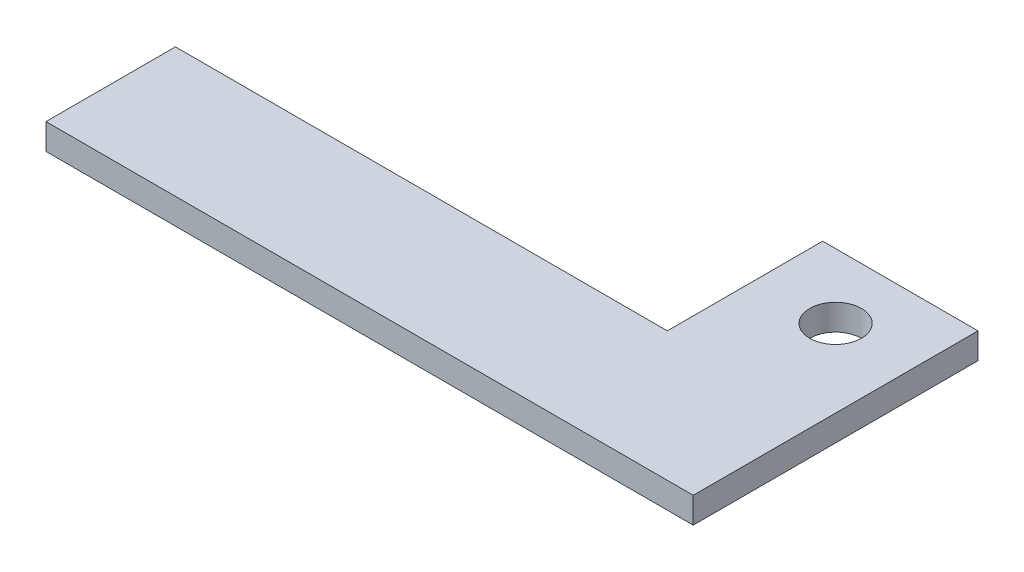
ISO-10303-21;
HEADER;
FILE_DESCRIPTION(('STEP AP214'),'2;1');
FILE_NAME('part.step','',(''),(''),'','','');
FILE_SCHEMA(('AUTOMOTIVE_DESIGN { 1 0 10303 214 1 1 1 1 }'));
ENDSEC;
DATA;
#1=APPLICATION_CONTEXT('core data for automotive mechanical design processes');
#2=APPLICATION_PROTOCOL_DEFINITION('international standard','automotive_design',2000,#1);
#3=PRODUCT_CONTEXT('',#1,'mechanical');
#4=PRODUCT('Part','Part','',(#3));
#5=PRODUCT_RELATED_PRODUCT_CATEGORY('part','',(#4));
#6=PRODUCT_DEFINITION_FORMATION('','',#4);
#7=PRODUCT_DEFINITION_CONTEXT('part definition',#1,'design');
#8=PRODUCT_DEFINITION('design','',#6,#7);
#9=PRODUCT_DEFINITION_SHAPE('','',#8);
#10=(LENGTH_UNIT() NAMED_UNIT(*) SI_UNIT(.MILLI.,.METRE.));
#11=(NAMED_UNIT(*) PLANE_ANGLE_UNIT() SI_UNIT($,.RADIAN.));
#12=(NAMED_UNIT(*) SI_UNIT($,.STERADIAN.) SOLID_ANGLE_UNIT());
#13=UNCERTAINTY_MEASURE_WITH_UNIT(LENGTH_MEASURE(1.E-05),#10,'distance_accuracy_value','');
#14=(GEOMETRIC_REPRESENTATION_CONTEXT(3) GLOBAL_UNCERTAINTY_ASSIGNED_CONTEXT((#13)) GLOBAL_UNIT_ASSIGNED_CONTEXT((#10,
#11,#12)) REPRESENTATION_CONTEXT('',''));
#15=CARTESIAN_POINT('',(0.,0.,0.));
#16=DIRECTION('',(0.,0.,1.));
#17=DIRECTION('',(1.,0.,0.));
#18=AXIS2_PLACEMENT_3D('',#15,#16,#17);
#19=CARTESIAN_POINT('',(0.,2.,0.));
#20=DIRECTION('',(0.,-1.,0.));
#21=DIRECTION('',(0.,0.,-1.));
#22=AXIS2_PLACEMENT_3D('',#19,#20,#21);
#23=PLANE('',#22);
#24=DIRECTION('',(0.,0.,-1.));
#25=VECTOR('',#24,1.);
#26=CARTESIAN_POINT('',(0.,2.,-22.));
#27=LINE('',#26,#25);
#28=CARTESIAN_POINT('',(0.,2.,0.));
#29=VERTEX_POINT('',#28);
#30=CARTESIAN_POINT('',(0.,2.,-22.));
#31=VERTEX_POINT('',#30);
#32=EDGE_CURVE('E128',#29,#31,#27,.T.);
#33=ORIENTED_EDGE('',*,*,#32,.T.);
#34=DIRECTION('',(-1.,0.,0.));
#35=VECTOR('',#34,1.);
#36=CARTESIAN_POINT('',(-12.,2.,-22.));
#37=LINE('',#36,#35);
#38=CARTESIAN_POINT('',(-12.,2.,-22.));
#39=VERTEX_POINT('',#38);
#40=EDGE_CURVE('E86',#31,#39,#37,.T.);
#41=ORIENTED_EDGE('',*,*,#40,.T.);
#42=DIRECTION('',(0.,0.,1.));
#43=VECTOR('',#42,1.);
#44=CARTESIAN_POINT('',(-12.,2.,-10.));
#45=LINE('',#44,#43);
#46=CARTESIAN_POINT('',(-12.,2.,-10.));
#47=VERTEX_POINT('',#46);
#48=EDGE_CURVE('E99',#39,#47,#45,.T.);
#49=ORIENTED_EDGE('',*,*,#48,.T.);
#50=DIRECTION('',(-1.,0.,0.));
#51=VECTOR('',#50,1.);
#52=CARTESIAN_POINT('',(-50.,2.,-9.99999999999999));
#53=LINE('',#52,#51);
#54=CARTESIAN_POINT('',(-50.,2.,-9.99999999999999));
#55=VERTEX_POINT('',#54);
#56=EDGE_CURVE('E93',#47,#55,#53,.T.);
#57=ORIENTED_EDGE('',*,*,#56,.T.);
#58=DIRECTION('',(0.,0.,1.));
#59=VECTOR('',#58,1.);
#60=CARTESIAN_POINT('',(-50.,2.,0.));
#61=LINE('',#60,#59);
#62=CARTESIAN_POINT('',(-50.,2.,0.));
#63=VERTEX_POINT('',#62);
#64=EDGE_CURVE('E97',#55,#63,#61,.T.);
#65=ORIENTED_EDGE('',*,*,#64,.T.);
#66=DIRECTION('',(1.,0.,0.));
#67=VECTOR('',#66,1.);
#68=CARTESIAN_POINT('',(0.,2.,0.));
#69=LINE('',#68,#67);
#70=EDGE_CURVE('E49',#63,#29,#69,.T.);
#71=ORIENTED_EDGE('',*,*,#70,.T.);
#72=EDGE_LOOP('',(#33,#41,#49,#57,#65,#71));
#73=FACE_BOUND('',#72,.T.);
#74=CARTESIAN_POINT('',(-6.,2.,-17.));
#75=DIRECTION('',(0.,1.,0.));
#76=DIRECTION('',(0.,0.,1.));
#77=AXIS2_PLACEMENT_3D('',#74,#75,#76);
#78=CIRCLE('',#77,2.);
#79=CARTESIAN_POINT('',(-6.,2.,-15.));
#80=VERTEX_POINT('',#79);
#81=EDGE_CURVE('E121',#80,#80,#78,.T.);
#82=ORIENTED_EDGE('',*,*,#81,.F.);
#83=EDGE_LOOP('',(#82));
#84=FACE_BOUND('',#83,.T.);
#85=ADVANCED_FACE('F32',(#73,#84),#23,.F.);
#86=CARTESIAN_POINT('',(0.,0.,0.));
#87=DIRECTION('',(0.,-1.,0.));
#88=DIRECTION('',(0.,0.,-1.));
#89=AXIS2_PLACEMENT_3D('',#86,#87,#88);
#90=PLANE('',#89);
#91=DIRECTION('',(0.,0.,-1.));
#92=VECTOR('',#91,1.);
#93=CARTESIAN_POINT('',(0.,0.,-22.));
#94=LINE('',#93,#92);
#95=CARTESIAN_POINT('',(0.,0.,0.));
#96=VERTEX_POINT('',#95);
#97=CARTESIAN_POINT('',(0.,0.,-22.));
#98=VERTEX_POINT('',#97);
#99=EDGE_CURVE('E117',#96,#98,#94,.T.);
#100=ORIENTED_EDGE('',*,*,#99,.F.);
#101=DIRECTION('',(1.,0.,0.));
#102=VECTOR('',#101,1.);
#103=CARTESIAN_POINT('',(0.,0.,0.));
#104=LINE('',#103,#102);
#105=CARTESIAN_POINT('',(-50.,0.,0.));
#106=VERTEX_POINT('',#105);
#107=EDGE_CURVE('E78',#106,#96,#104,.T.);
#108=ORIENTED_EDGE('',*,*,#107,.F.);
#109=DIRECTION('',(0.,0.,1.));
#110=VECTOR('',#109,1.);
#111=CARTESIAN_POINT('',(-50.,0.,0.));
#112=LINE('',#111,#110);
#113=CARTESIAN_POINT('',(-50.,0.,-9.99999999999999));
#114=VERTEX_POINT('',#113);
#115=EDGE_CURVE('E72',#114,#106,#112,.T.);
#116=ORIENTED_EDGE('',*,*,#115,.F.);
#117=DIRECTION('',(-1.,0.,0.));
#118=VECTOR('',#117,1.);
#119=CARTESIAN_POINT('',(-50.,0.,-9.99999999999999));
#120=LINE('',#119,#118);
#121=CARTESIAN_POINT('',(-12.,0.,-10.));
#122=VERTEX_POINT('',#121);
#123=EDGE_CURVE('E107',#122,#114,#120,.T.);
#124=ORIENTED_EDGE('',*,*,#123,.F.);
#125=DIRECTION('',(0.,0.,1.));
#126=VECTOR('',#125,1.);
#127=CARTESIAN_POINT('',(-12.,0.,-10.));
#128=LINE('',#127,#126);
#129=CARTESIAN_POINT('',(-12.,0.,-22.));
#130=VERTEX_POINT('',#129);
#131=EDGE_CURVE('E123',#130,#122,#128,.T.);
#132=ORIENTED_EDGE('',*,*,#131,.F.);
#133=DIRECTION('',(-1.,0.,0.));
#134=VECTOR('',#133,1.);
#135=CARTESIAN_POINT('',(-12.,0.,-22.));
#136=LINE('',#135,#134);
#137=EDGE_CURVE('E120',#98,#130,#136,.T.);
#138=ORIENTED_EDGE('',*,*,#137,.F.);
#139=EDGE_LOOP('',(#100,#108,#116,#124,#132,#138));
#140=FACE_BOUND('',#139,.T.);
#141=CARTESIAN_POINT('',(-6.,0.,-17.));
#142=DIRECTION('',(0.,1.,0.));
#143=DIRECTION('',(0.,0.,1.));
#144=AXIS2_PLACEMENT_3D('',#141,#142,#143);
#145=CIRCLE('',#144,2.);
#146=CARTESIAN_POINT('',(-6.,0.,-15.));
#147=VERTEX_POINT('',#146);
#148=EDGE_CURVE('E221',#147,#147,#145,.T.);
#149=ORIENTED_EDGE('',*,*,#148,.T.);
#150=EDGE_LOOP('',(#149));
#151=FACE_BOUND('',#150,.T.);
#152=ADVANCED_FACE('F137',(#140,#151),#90,.T.);
#153=CARTESIAN_POINT('',(0.,2.,-22.));
#154=DIRECTION('',(-1.,0.,0.));
#155=DIRECTION('',(0.,0.,1.));
#156=AXIS2_PLACEMENT_3D('',#153,#154,#155);
#157=PLANE('',#156);
#158=ORIENTED_EDGE('',*,*,#99,.T.);
#159=DIRECTION('',(0.,-1.,0.));
#160=VECTOR('',#159,1.);
#161=CARTESIAN_POINT('',(0.,2.,-22.));
#162=LINE('',#161,#160);
#163=EDGE_CURVE('E11',#31,#98,#162,.T.);
#164=ORIENTED_EDGE('',*,*,#163,.F.);
#165=ORIENTED_EDGE('',*,*,#32,.F.);
#166=DIRECTION('',(0.,-1.,0.));
#167=VECTOR('',#166,1.);
#168=CARTESIAN_POINT('',(0.,2.,0.));
#169=LINE('',#168,#167);
#170=EDGE_CURVE('E113',#29,#96,#169,.T.);
#171=ORIENTED_EDGE('',*,*,#170,.T.);
#172=EDGE_LOOP('',(#158,#164,#165,#171));
#173=FACE_BOUND('',#172,.T.);
#174=ADVANCED_FACE('F34',(#173),#157,.F.);
#175=CARTESIAN_POINT('',(-12.,2.,-22.));
#176=DIRECTION('',(0.,0.,1.));
#177=DIRECTION('',(1.,0.,0.));
#178=AXIS2_PLACEMENT_3D('',#175,#176,#177);
#179=PLANE('',#178);
#180=ORIENTED_EDGE('',*,*,#137,.T.);
#181=DIRECTION('',(0.,-1.,0.));
#182=VECTOR('',#181,1.);
#183=CARTESIAN_POINT('',(-12.,2.,-22.));
#184=LINE('',#183,#182);
#185=EDGE_CURVE('E41',#39,#130,#184,.T.);
#186=ORIENTED_EDGE('',*,*,#185,.F.);
#187=ORIENTED_EDGE('',*,*,#40,.F.);
#188=ORIENTED_EDGE('',*,*,#163,.T.);
#189=EDGE_LOOP('',(#180,#186,#187,#188));
#190=FACE_BOUND('',#189,.T.);
#191=ADVANCED_FACE('F162',(#190),#179,.F.);
#192=CARTESIAN_POINT('',(-12.,2.,-10.));
#193=DIRECTION('',(1.,0.,0.));
#194=DIRECTION('',(0.,0.,-1.));
#195=AXIS2_PLACEMENT_3D('',#192,#193,#194);
#196=PLANE('',#195);
#197=ORIENTED_EDGE('',*,*,#131,.T.);
#198=DIRECTION('',(0.,-1.,0.));
#199=VECTOR('',#198,1.);
#200=CARTESIAN_POINT('',(-12.,2.,-10.));
#201=LINE('',#200,#199);
#202=EDGE_CURVE('E108',#47,#122,#201,.T.);
#203=ORIENTED_EDGE('',*,*,#202,.F.);
#204=ORIENTED_EDGE('',*,*,#48,.F.);
#205=ORIENTED_EDGE('',*,*,#185,.T.);
#206=EDGE_LOOP('',(#197,#203,#204,#205));
#207=FACE_BOUND('',#206,.T.);
#208=ADVANCED_FACE('F134',(#207),#196,.F.);
#209=CARTESIAN_POINT('',(-50.,2.,-9.99999999999999));
#210=DIRECTION('',(0.,0.,1.));
#211=DIRECTION('',(1.,0.,0.));
#212=AXIS2_PLACEMENT_3D('',#209,#210,#211);
#213=PLANE('',#212);
#214=ORIENTED_EDGE('',*,*,#123,.T.);
#215=DIRECTION('',(0.,-1.,0.));
#216=VECTOR('',#215,1.);
#217=CARTESIAN_POINT('',(-50.,2.,-9.99999999999999));
#218=LINE('',#217,#216);
#219=EDGE_CURVE('E104',#55,#114,#218,.T.);
#220=ORIENTED_EDGE('',*,*,#219,.F.);
#221=ORIENTED_EDGE('',*,*,#56,.F.);
#222=ORIENTED_EDGE('',*,*,#202,.T.);
#223=EDGE_LOOP('',(#214,#220,#221,#222));
#224=FACE_BOUND('',#223,.T.);
#225=ADVANCED_FACE('F105',(#224),#213,.F.);
#226=CARTESIAN_POINT('',(-50.,2.,0.));
#227=DIRECTION('',(1.,0.,0.));
#228=DIRECTION('',(0.,0.,-1.));
#229=AXIS2_PLACEMENT_3D('',#226,#227,#228);
#230=PLANE('',#229);
#231=ORIENTED_EDGE('',*,*,#115,.T.);
#232=DIRECTION('',(0.,-1.,0.));
#233=VECTOR('',#232,1.);
#234=CARTESIAN_POINT('',(-50.,2.,0.));
#235=LINE('',#234,#233);
#236=EDGE_CURVE('E109',#63,#106,#235,.T.);
#237=ORIENTED_EDGE('',*,*,#236,.F.);
#238=ORIENTED_EDGE('',*,*,#64,.F.);
#239=ORIENTED_EDGE('',*,*,#219,.T.);
#240=EDGE_LOOP('',(#231,#237,#238,#239));
#241=FACE_BOUND('',#240,.T.);
#242=ADVANCED_FACE('F111',(#241),#230,.F.);
#243=CARTESIAN_POINT('',(0.,2.,0.));
#244=DIRECTION('',(0.,0.,-1.));
#245=DIRECTION('',(-1.,0.,0.));
#246=AXIS2_PLACEMENT_3D('',#243,#244,#245);
#247=PLANE('',#246);
#248=ORIENTED_EDGE('',*,*,#107,.T.);
#249=ORIENTED_EDGE('',*,*,#170,.F.);
#250=ORIENTED_EDGE('',*,*,#70,.F.);
#251=ORIENTED_EDGE('',*,*,#236,.T.);
#252=EDGE_LOOP('',(#248,#249,#250,#251));
#253=FACE_BOUND('',#252,.T.);
#254=ADVANCED_FACE('F142',(#253),#247,.F.);
#255=CARTESIAN_POINT('',(-6.,2.,-17.));
#256=DIRECTION('',(0.,-1.,0.));
#257=DIRECTION('',(0.,0.,-1.));
#258=AXIS2_PLACEMENT_3D('',#255,#256,#257);
#259=CYLINDRICAL_SURFACE('',#258,2.);
#260=ORIENTED_EDGE('',*,*,#81,.T.);
#261=EDGE_LOOP('',(#260));
#262=FACE_BOUND('',#261,.T.);
#263=ORIENTED_EDGE('',*,*,#148,.F.);
#264=EDGE_LOOP('',(#263));
#265=FACE_BOUND('',#264,.T.);
#266=ADVANCED_FACE('F144',(#262,#265),#259,.F.);
#267=CLOSED_SHELL('',(#85,#152,#174,#191,#208,#225,#242,#254,#266));
#268=MANIFOLD_SOLID_BREP('B2',#267);
#269=ADVANCED_BREP_SHAPE_REPRESENTATION('',(#18,#268),#14);
#270=SHAPE_DEFINITION_REPRESENTATION(#9,#269);
ENDSEC;
END-ISO-10303-21;
